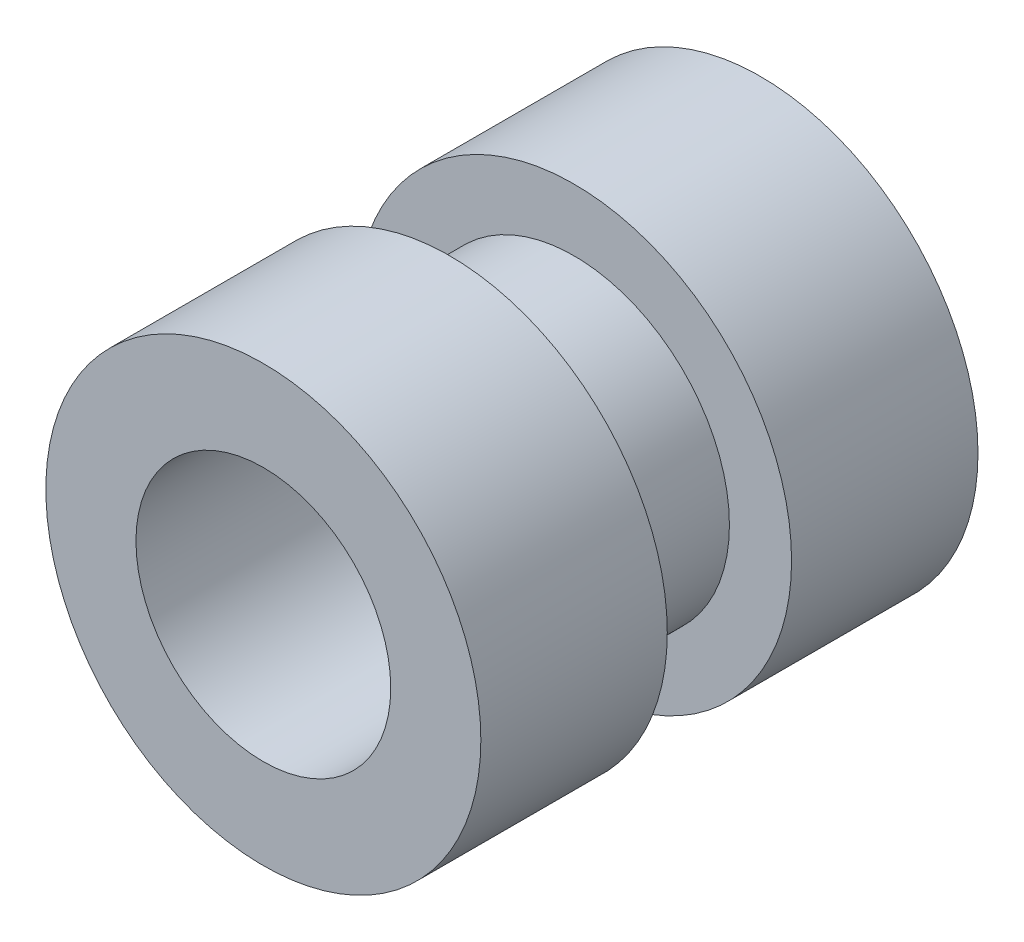
ISO-10303-21;
HEADER;
FILE_DESCRIPTION(('STEP AP214'),'2;1');
FILE_NAME('part.step','',(''),(''),'','','');
FILE_SCHEMA(('AUTOMOTIVE_DESIGN { 1 0 10303 214 1 1 1 1 }'));
ENDSEC;
DATA;
#1=APPLICATION_CONTEXT('core data for automotive mechanical design processes');
#2=APPLICATION_PROTOCOL_DEFINITION('international standard','automotive_design',2000,#1);
#3=PRODUCT_CONTEXT('',#1,'mechanical');
#4=PRODUCT('Part','Part','',(#3));
#5=PRODUCT_RELATED_PRODUCT_CATEGORY('part','',(#4));
#6=PRODUCT_DEFINITION_FORMATION('','',#4);
#7=PRODUCT_DEFINITION_CONTEXT('part definition',#1,'design');
#8=PRODUCT_DEFINITION('design','',#6,#7);
#9=PRODUCT_DEFINITION_SHAPE('','',#8);
#10=(LENGTH_UNIT() NAMED_UNIT(*) SI_UNIT(.MILLI.,.METRE.));
#11=(NAMED_UNIT(*) PLANE_ANGLE_UNIT() SI_UNIT($,.RADIAN.));
#12=(NAMED_UNIT(*) SI_UNIT($,.STERADIAN.) SOLID_ANGLE_UNIT());
#13=UNCERTAINTY_MEASURE_WITH_UNIT(LENGTH_MEASURE(1.E-05),#10,'distance_accuracy_value','');
#14=(GEOMETRIC_REPRESENTATION_CONTEXT(3) GLOBAL_UNCERTAINTY_ASSIGNED_CONTEXT((#13)) GLOBAL_UNIT_ASSIGNED_CONTEXT((#10,
#11,#12)) REPRESENTATION_CONTEXT('',''));
#15=CARTESIAN_POINT('',(0.,0.,0.));
#16=DIRECTION('',(0.,0.,1.));
#17=DIRECTION('',(1.,0.,0.));
#18=AXIS2_PLACEMENT_3D('',#15,#16,#17);
#19=CARTESIAN_POINT('',(0.,0.,1.5));
#20=DIRECTION('',(0.,0.,-1.));
#21=DIRECTION('',(-1.,0.,0.));
#22=AXIS2_PLACEMENT_3D('',#19,#20,#21);
#23=CYLINDRICAL_SURFACE('',#22,1.75);
#24=CARTESIAN_POINT('',(0.,0.,1.5));
#25=DIRECTION('',(0.,0.,1.));
#26=DIRECTION('',(1.,0.,0.));
#27=AXIS2_PLACEMENT_3D('',#24,#25,#26);
#28=CIRCLE('',#27,1.75);
#29=CARTESIAN_POINT('',(1.75,0.,1.5));
#30=VERTEX_POINT('',#29);
#31=EDGE_CURVE('E45',#30,#30,#28,.T.);
#32=ORIENTED_EDGE('',*,*,#31,.F.);
#33=EDGE_LOOP('',(#32));
#34=FACE_BOUND('',#33,.T.);
#35=CARTESIAN_POINT('',(0.,0.,0.));
#36=DIRECTION('',(0.,0.,1.));
#37=DIRECTION('',(1.,0.,0.));
#38=AXIS2_PLACEMENT_3D('',#35,#36,#37);
#39=CIRCLE('',#38,1.75);
#40=CARTESIAN_POINT('',(1.75,0.,0.));
#41=VERTEX_POINT('',#40);
#42=EDGE_CURVE('E41',#41,#41,#39,.T.);
#43=ORIENTED_EDGE('',*,*,#42,.T.);
#44=EDGE_LOOP('',(#43));
#45=FACE_BOUND('',#44,.T.);
#46=ADVANCED_FACE('F38',(#34,#45),#23,.T.);
#47=CARTESIAN_POINT('',(0.,0.,1.5));
#48=DIRECTION('',(0.,0.,1.));
#49=DIRECTION('',(1.,0.,0.));
#50=AXIS2_PLACEMENT_3D('',#47,#48,#49);
#51=PLANE('',#50);
#52=CARTESIAN_POINT('',(0.,0.,1.5));
#53=DIRECTION('',(0.,0.,1.));
#54=DIRECTION('',(1.,0.,0.));
#55=AXIS2_PLACEMENT_3D('',#52,#53,#54);
#56=CIRCLE('',#55,1.25);
#57=CARTESIAN_POINT('',(1.25,0.,1.5));
#58=VERTEX_POINT('',#57);
#59=EDGE_CURVE('E10',#58,#58,#56,.T.);
#60=ORIENTED_EDGE('',*,*,#59,.F.);
#61=EDGE_LOOP('',(#60));
#62=FACE_BOUND('',#61,.T.);
#63=ORIENTED_EDGE('',*,*,#31,.T.);
#64=EDGE_LOOP('',(#63));
#65=FACE_BOUND('',#64,.T.);
#66=ADVANCED_FACE('F92',(#62,#65),#51,.T.);
#67=CARTESIAN_POINT('',(0.,0.,0.));
#68=DIRECTION('',(0.,0.,1.));
#69=DIRECTION('',(1.,0.,0.));
#70=AXIS2_PLACEMENT_3D('',#67,#68,#69);
#71=PLANE('',#70);
#72=CARTESIAN_POINT('',(0.,0.,0.));
#73=DIRECTION('',(0.,0.,1.));
#74=DIRECTION('',(1.,0.,0.));
#75=AXIS2_PLACEMENT_3D('',#72,#73,#74);
#76=CIRCLE('',#75,1.025);
#77=CARTESIAN_POINT('',(1.025,0.,0.));
#78=VERTEX_POINT('',#77);
#79=EDGE_CURVE('E58',#78,#78,#76,.T.);
#80=ORIENTED_EDGE('',*,*,#79,.T.);
#81=EDGE_LOOP('',(#80));
#82=FACE_BOUND('',#81,.T.);
#83=ORIENTED_EDGE('',*,*,#42,.F.);
#84=EDGE_LOOP('',(#83));
#85=FACE_BOUND('',#84,.T.);
#86=ADVANCED_FACE('F97',(#82,#85),#71,.F.);
#87=CARTESIAN_POINT('',(0.,0.,2.5));
#88=DIRECTION('',(0.,0.,-1.));
#89=DIRECTION('',(-1.,0.,0.));
#90=AXIS2_PLACEMENT_3D('',#87,#88,#89);
#91=CYLINDRICAL_SURFACE('',#90,1.25);
#92=CARTESIAN_POINT('',(0.,0.,2.5));
#93=DIRECTION('',(0.,0.,1.));
#94=DIRECTION('',(1.,0.,0.));
#95=AXIS2_PLACEMENT_3D('',#92,#93,#94);
#96=CIRCLE('',#95,1.25);
#97=CARTESIAN_POINT('',(1.25,0.,2.5));
#98=VERTEX_POINT('',#97);
#99=EDGE_CURVE('E51',#98,#98,#96,.T.);
#100=ORIENTED_EDGE('',*,*,#99,.F.);
#101=EDGE_LOOP('',(#100));
#102=FACE_BOUND('',#101,.T.);
#103=ORIENTED_EDGE('',*,*,#59,.T.);
#104=EDGE_LOOP('',(#103));
#105=FACE_BOUND('',#104,.T.);
#106=ADVANCED_FACE('F79',(#102,#105),#91,.T.);
#107=CARTESIAN_POINT('',(0.,0.,4.));
#108=DIRECTION('',(0.,0.,-1.));
#109=DIRECTION('',(-1.,0.,0.));
#110=AXIS2_PLACEMENT_3D('',#107,#108,#109);
#111=CYLINDRICAL_SURFACE('',#110,1.75);
#112=CARTESIAN_POINT('',(0.,0.,4.));
#113=DIRECTION('',(0.,0.,1.));
#114=DIRECTION('',(1.,0.,0.));
#115=AXIS2_PLACEMENT_3D('',#112,#113,#114);
#116=CIRCLE('',#115,1.75);
#117=CARTESIAN_POINT('',(1.75,0.,4.));
#118=VERTEX_POINT('',#117);
#119=EDGE_CURVE('E54',#118,#118,#116,.T.);
#120=ORIENTED_EDGE('',*,*,#119,.F.);
#121=EDGE_LOOP('',(#120));
#122=FACE_BOUND('',#121,.T.);
#123=CARTESIAN_POINT('',(0.,0.,2.5));
#124=DIRECTION('',(0.,0.,1.));
#125=DIRECTION('',(1.,0.,0.));
#126=AXIS2_PLACEMENT_3D('',#123,#124,#125);
#127=CIRCLE('',#126,1.75);
#128=CARTESIAN_POINT('',(1.75,0.,2.5));
#129=VERTEX_POINT('',#128);
#130=EDGE_CURVE('E55',#129,#129,#127,.T.);
#131=ORIENTED_EDGE('',*,*,#130,.T.);
#132=EDGE_LOOP('',(#131));
#133=FACE_BOUND('',#132,.T.);
#134=ADVANCED_FACE('F73',(#122,#133),#111,.T.);
#135=CARTESIAN_POINT('',(0.,0.,4.));
#136=DIRECTION('',(0.,0.,1.));
#137=DIRECTION('',(1.,0.,0.));
#138=AXIS2_PLACEMENT_3D('',#135,#136,#137);
#139=PLANE('',#138);
#140=CARTESIAN_POINT('',(0.,0.,4.));
#141=DIRECTION('',(0.,0.,1.));
#142=DIRECTION('',(1.,0.,0.));
#143=AXIS2_PLACEMENT_3D('',#140,#141,#142);
#144=CIRCLE('',#143,1.025);
#145=CARTESIAN_POINT('',(1.025,0.,4.));
#146=VERTEX_POINT('',#145);
#147=EDGE_CURVE('E63',#146,#146,#144,.T.);
#148=ORIENTED_EDGE('',*,*,#147,.F.);
#149=EDGE_LOOP('',(#148));
#150=FACE_BOUND('',#149,.T.);
#151=ORIENTED_EDGE('',*,*,#119,.T.);
#152=EDGE_LOOP('',(#151));
#153=FACE_BOUND('',#152,.T.);
#154=ADVANCED_FACE('F69',(#150,#153),#139,.T.);
#155=CARTESIAN_POINT('',(0.,0.,2.5));
#156=DIRECTION('',(0.,0.,1.));
#157=DIRECTION('',(1.,0.,0.));
#158=AXIS2_PLACEMENT_3D('',#155,#156,#157);
#159=PLANE('',#158);
#160=ORIENTED_EDGE('',*,*,#99,.T.);
#161=EDGE_LOOP('',(#160));
#162=FACE_BOUND('',#161,.T.);
#163=ORIENTED_EDGE('',*,*,#130,.F.);
#164=EDGE_LOOP('',(#163));
#165=FACE_BOUND('',#164,.T.);
#166=ADVANCED_FACE('F72',(#162,#165),#159,.F.);
#167=CARTESIAN_POINT('',(0.,0.,4.));
#168=DIRECTION('',(0.,0.,1.));
#169=DIRECTION('',(1.,0.,0.));
#170=AXIS2_PLACEMENT_3D('',#167,#168,#169);
#171=CYLINDRICAL_SURFACE('',#170,1.025);
#172=ORIENTED_EDGE('',*,*,#79,.F.);
#173=EDGE_LOOP('',(#172));
#174=FACE_BOUND('',#173,.T.);
#175=ORIENTED_EDGE('',*,*,#147,.T.);
#176=EDGE_LOOP('',(#175));
#177=FACE_BOUND('',#176,.T.);
#178=ADVANCED_FACE('F67',(#174,#177),#171,.F.);
#179=CLOSED_SHELL('',(#46,#66,#86,#106,#134,#154,#166,#178));
#180=MANIFOLD_SOLID_BREP('B2',#179);
#181=ADVANCED_BREP_SHAPE_REPRESENTATION('',(#18,#180),#14);
#182=SHAPE_DEFINITION_REPRESENTATION(#9,#181);
ENDSEC;
END-ISO-10303-21;
